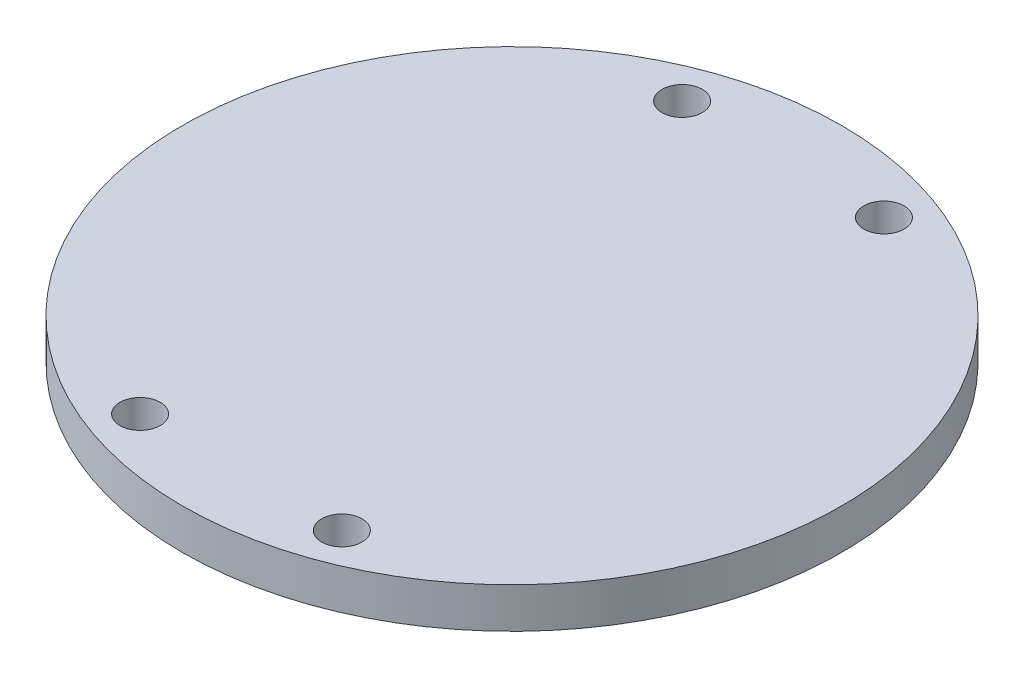
ISO-10303-21;
HEADER;
FILE_DESCRIPTION(('STEP AP214'),'2;1');
FILE_NAME('part.step','',(''),(''),'','','');
FILE_SCHEMA(('AUTOMOTIVE_DESIGN { 1 0 10303 214 1 1 1 1 }'));
ENDSEC;
DATA;
#1=APPLICATION_CONTEXT('core data for automotive mechanical design processes');
#2=APPLICATION_PROTOCOL_DEFINITION('international standard','automotive_design',2000,#1);
#3=PRODUCT_CONTEXT('',#1,'mechanical');
#4=PRODUCT('Part','Part','',(#3));
#5=PRODUCT_RELATED_PRODUCT_CATEGORY('part','',(#4));
#6=PRODUCT_DEFINITION_FORMATION('','',#4);
#7=PRODUCT_DEFINITION_CONTEXT('part definition',#1,'design');
#8=PRODUCT_DEFINITION('design','',#6,#7);
#9=PRODUCT_DEFINITION_SHAPE('','',#8);
#10=(LENGTH_UNIT() NAMED_UNIT(*) SI_UNIT(.MILLI.,.METRE.));
#11=(NAMED_UNIT(*) PLANE_ANGLE_UNIT() SI_UNIT($,.RADIAN.));
#12=(NAMED_UNIT(*) SI_UNIT($,.STERADIAN.) SOLID_ANGLE_UNIT());
#13=UNCERTAINTY_MEASURE_WITH_UNIT(LENGTH_MEASURE(1.E-05),#10,'distance_accuracy_value','');
#14=(GEOMETRIC_REPRESENTATION_CONTEXT(3) GLOBAL_UNCERTAINTY_ASSIGNED_CONTEXT((#13)) GLOBAL_UNIT_ASSIGNED_CONTEXT((#10,
#11,#12)) REPRESENTATION_CONTEXT('',''));
#15=CARTESIAN_POINT('',(0.,0.,0.));
#16=DIRECTION('',(0.,0.,1.));
#17=DIRECTION('',(1.,0.,0.));
#18=AXIS2_PLACEMENT_3D('',#15,#16,#17);
#19=CARTESIAN_POINT('',(0.,6.,0.));
#20=DIRECTION('',(0.,-1.,0.));
#21=DIRECTION('',(0.,0.,-1.));
#22=AXIS2_PLACEMENT_3D('',#19,#20,#21);
#23=CYLINDRICAL_SURFACE('',#22,49.);
#24=CARTESIAN_POINT('',(0.,6.,0.));
#25=DIRECTION('',(0.,1.,0.));
#26=DIRECTION('',(0.,0.,1.));
#27=AXIS2_PLACEMENT_3D('',#24,#25,#26);
#28=CIRCLE('',#27,49.);
#29=CARTESIAN_POINT('',(0.,6.,49.));
#30=VERTEX_POINT('',#29);
#31=EDGE_CURVE('E10',#30,#30,#28,.T.);
#32=ORIENTED_EDGE('',*,*,#31,.F.);
#33=EDGE_LOOP('',(#32));
#34=FACE_BOUND('',#33,.T.);
#35=CARTESIAN_POINT('',(0.,0.,0.));
#36=DIRECTION('',(0.,1.,0.));
#37=DIRECTION('',(0.,0.,1.));
#38=AXIS2_PLACEMENT_3D('',#35,#36,#37);
#39=CIRCLE('',#38,49.);
#40=CARTESIAN_POINT('',(0.,0.,49.));
#41=VERTEX_POINT('',#40);
#42=EDGE_CURVE('E35',#41,#41,#39,.T.);
#43=ORIENTED_EDGE('',*,*,#42,.T.);
#44=EDGE_LOOP('',(#43));
#45=FACE_BOUND('',#44,.T.);
#46=ADVANCED_FACE('F32',(#34,#45),#23,.T.);
#47=CARTESIAN_POINT('',(0.,6.,0.));
#48=DIRECTION('',(0.,1.,0.));
#49=DIRECTION('',(0.,0.,1.));
#50=AXIS2_PLACEMENT_3D('',#47,#48,#49);
#51=PLANE('',#50);
#52=CARTESIAN_POINT('',(-15.,6.,40.2988833592198));
#53=DIRECTION('',(0.,1.,0.));
#54=DIRECTION('',(0.,0.,1.));
#55=AXIS2_PLACEMENT_3D('',#52,#53,#54);
#56=CIRCLE('',#55,3.);
#57=CARTESIAN_POINT('',(-15.,6.,43.2988833592198));
#58=VERTEX_POINT('',#57);
#59=EDGE_CURVE('E62',#58,#58,#56,.T.);
#60=ORIENTED_EDGE('',*,*,#59,.F.);
#61=EDGE_LOOP('',(#60));
#62=FACE_BOUND('',#61,.T.);
#63=CARTESIAN_POINT('',(15.,6.,40.2988833592198));
#64=DIRECTION('',(0.,1.,0.));
#65=DIRECTION('',(0.,0.,1.));
#66=AXIS2_PLACEMENT_3D('',#63,#64,#65);
#67=CIRCLE('',#66,3.);
#68=CARTESIAN_POINT('',(15.,6.,43.2988833592198));
#69=VERTEX_POINT('',#68);
#70=EDGE_CURVE('E56',#69,#69,#67,.T.);
#71=ORIENTED_EDGE('',*,*,#70,.F.);
#72=EDGE_LOOP('',(#71));
#73=FACE_BOUND('',#72,.T.);
#74=CARTESIAN_POINT('',(15.,6.,-40.2988833592198));
#75=DIRECTION('',(0.,1.,0.));
#76=DIRECTION('',(0.,0.,1.));
#77=AXIS2_PLACEMENT_3D('',#74,#75,#76);
#78=CIRCLE('',#77,3.);
#79=CARTESIAN_POINT('',(15.,6.,-37.2988833592198));
#80=VERTEX_POINT('',#79);
#81=EDGE_CURVE('E50',#80,#80,#78,.T.);
#82=ORIENTED_EDGE('',*,*,#81,.F.);
#83=EDGE_LOOP('',(#82));
#84=FACE_BOUND('',#83,.T.);
#85=CARTESIAN_POINT('',(-15.,6.,-40.2988833592198));
#86=DIRECTION('',(0.,1.,0.));
#87=DIRECTION('',(0.,0.,1.));
#88=AXIS2_PLACEMENT_3D('',#85,#86,#87);
#89=CIRCLE('',#88,3.);
#90=CARTESIAN_POINT('',(-15.,6.,-37.2988833592198));
#91=VERTEX_POINT('',#90);
#92=EDGE_CURVE('E44',#91,#91,#89,.T.);
#93=ORIENTED_EDGE('',*,*,#92,.F.);
#94=EDGE_LOOP('',(#93));
#95=FACE_BOUND('',#94,.T.);
#96=ORIENTED_EDGE('',*,*,#31,.T.);
#97=EDGE_LOOP('',(#96));
#98=FACE_BOUND('',#97,.T.);
#99=ADVANCED_FACE('F78',(#62,#73,#84,#95,#98),#51,.T.);
#100=CARTESIAN_POINT('',(0.,0.,0.));
#101=DIRECTION('',(0.,1.,0.));
#102=DIRECTION('',(0.,0.,1.));
#103=AXIS2_PLACEMENT_3D('',#100,#101,#102);
#104=PLANE('',#103);
#105=CARTESIAN_POINT('',(-15.,0.,40.2988833592198));
#106=DIRECTION('',(0.,1.,0.));
#107=DIRECTION('',(0.,0.,1.));
#108=AXIS2_PLACEMENT_3D('',#105,#106,#107);
#109=CIRCLE('',#108,3.);
#110=CARTESIAN_POINT('',(-15.,0.,43.2988833592198));
#111=VERTEX_POINT('',#110);
#112=EDGE_CURVE('E59',#111,#111,#109,.T.);
#113=ORIENTED_EDGE('',*,*,#112,.T.);
#114=EDGE_LOOP('',(#113));
#115=FACE_BOUND('',#114,.T.);
#116=CARTESIAN_POINT('',(15.,0.,40.2988833592198));
#117=DIRECTION('',(0.,1.,0.));
#118=DIRECTION('',(0.,0.,1.));
#119=AXIS2_PLACEMENT_3D('',#116,#117,#118);
#120=CIRCLE('',#119,3.);
#121=CARTESIAN_POINT('',(15.,0.,43.2988833592198));
#122=VERTEX_POINT('',#121);
#123=EDGE_CURVE('E53',#122,#122,#120,.T.);
#124=ORIENTED_EDGE('',*,*,#123,.T.);
#125=EDGE_LOOP('',(#124));
#126=FACE_BOUND('',#125,.T.);
#127=CARTESIAN_POINT('',(15.,0.,-40.2988833592198));
#128=DIRECTION('',(0.,1.,0.));
#129=DIRECTION('',(0.,0.,1.));
#130=AXIS2_PLACEMENT_3D('',#127,#128,#129);
#131=CIRCLE('',#130,3.);
#132=CARTESIAN_POINT('',(15.,0.,-37.2988833592198));
#133=VERTEX_POINT('',#132);
#134=EDGE_CURVE('E47',#133,#133,#131,.T.);
#135=ORIENTED_EDGE('',*,*,#134,.T.);
#136=EDGE_LOOP('',(#135));
#137=FACE_BOUND('',#136,.T.);
#138=CARTESIAN_POINT('',(-15.,0.,-40.2988833592198));
#139=DIRECTION('',(0.,1.,0.));
#140=DIRECTION('',(0.,0.,1.));
#141=AXIS2_PLACEMENT_3D('',#138,#139,#140);
#142=CIRCLE('',#141,3.);
#143=CARTESIAN_POINT('',(-15.,0.,-37.2988833592198));
#144=VERTEX_POINT('',#143);
#145=EDGE_CURVE('E42',#144,#144,#142,.T.);
#146=ORIENTED_EDGE('',*,*,#145,.T.);
#147=EDGE_LOOP('',(#146));
#148=FACE_BOUND('',#147,.T.);
#149=ORIENTED_EDGE('',*,*,#42,.F.);
#150=EDGE_LOOP('',(#149));
#151=FACE_BOUND('',#150,.T.);
#152=ADVANCED_FACE('F68',(#115,#126,#137,#148,#151),#104,.F.);
#153=CARTESIAN_POINT('',(-15.,0.,-40.2988833592198));
#154=DIRECTION('',(0.,1.,0.));
#155=DIRECTION('',(0.,0.,1.));
#156=AXIS2_PLACEMENT_3D('',#153,#154,#155);
#157=CYLINDRICAL_SURFACE('',#156,3.);
#158=ORIENTED_EDGE('',*,*,#145,.F.);
#159=EDGE_LOOP('',(#158));
#160=FACE_BOUND('',#159,.T.);
#161=ORIENTED_EDGE('',*,*,#92,.T.);
#162=EDGE_LOOP('',(#161));
#163=FACE_BOUND('',#162,.T.);
#164=ADVANCED_FACE('F88',(#160,#163),#157,.F.);
#165=CARTESIAN_POINT('',(15.,0.,-40.2988833592198));
#166=DIRECTION('',(0.,1.,0.));
#167=DIRECTION('',(0.,0.,1.));
#168=AXIS2_PLACEMENT_3D('',#165,#166,#167);
#169=CYLINDRICAL_SURFACE('',#168,3.);
#170=ORIENTED_EDGE('',*,*,#134,.F.);
#171=EDGE_LOOP('',(#170));
#172=FACE_BOUND('',#171,.T.);
#173=ORIENTED_EDGE('',*,*,#81,.T.);
#174=EDGE_LOOP('',(#173));
#175=FACE_BOUND('',#174,.T.);
#176=ADVANCED_FACE('F90',(#172,#175),#169,.F.);
#177=CARTESIAN_POINT('',(15.,0.,40.2988833592198));
#178=DIRECTION('',(0.,1.,0.));
#179=DIRECTION('',(0.,0.,1.));
#180=AXIS2_PLACEMENT_3D('',#177,#178,#179);
#181=CYLINDRICAL_SURFACE('',#180,3.);
#182=ORIENTED_EDGE('',*,*,#123,.F.);
#183=EDGE_LOOP('',(#182));
#184=FACE_BOUND('',#183,.T.);
#185=ORIENTED_EDGE('',*,*,#70,.T.);
#186=EDGE_LOOP('',(#185));
#187=FACE_BOUND('',#186,.T.);
#188=ADVANCED_FACE('F74',(#184,#187),#181,.F.);
#189=CARTESIAN_POINT('',(-15.,0.,40.2988833592198));
#190=DIRECTION('',(0.,1.,0.));
#191=DIRECTION('',(0.,0.,1.));
#192=AXIS2_PLACEMENT_3D('',#189,#190,#191);
#193=CYLINDRICAL_SURFACE('',#192,3.);
#194=ORIENTED_EDGE('',*,*,#112,.F.);
#195=EDGE_LOOP('',(#194));
#196=FACE_BOUND('',#195,.T.);
#197=ORIENTED_EDGE('',*,*,#59,.T.);
#198=EDGE_LOOP('',(#197));
#199=FACE_BOUND('',#198,.T.);
#200=ADVANCED_FACE('F71',(#196,#199),#193,.F.);
#201=CLOSED_SHELL('',(#46,#99,#152,#164,#176,#188,#200));
#202=MANIFOLD_SOLID_BREP('B2',#201);
#203=ADVANCED_BREP_SHAPE_REPRESENTATION('',(#18,#202),#14);
#204=SHAPE_DEFINITION_REPRESENTATION(#9,#203);
ENDSEC;
END-ISO-10303-21;
